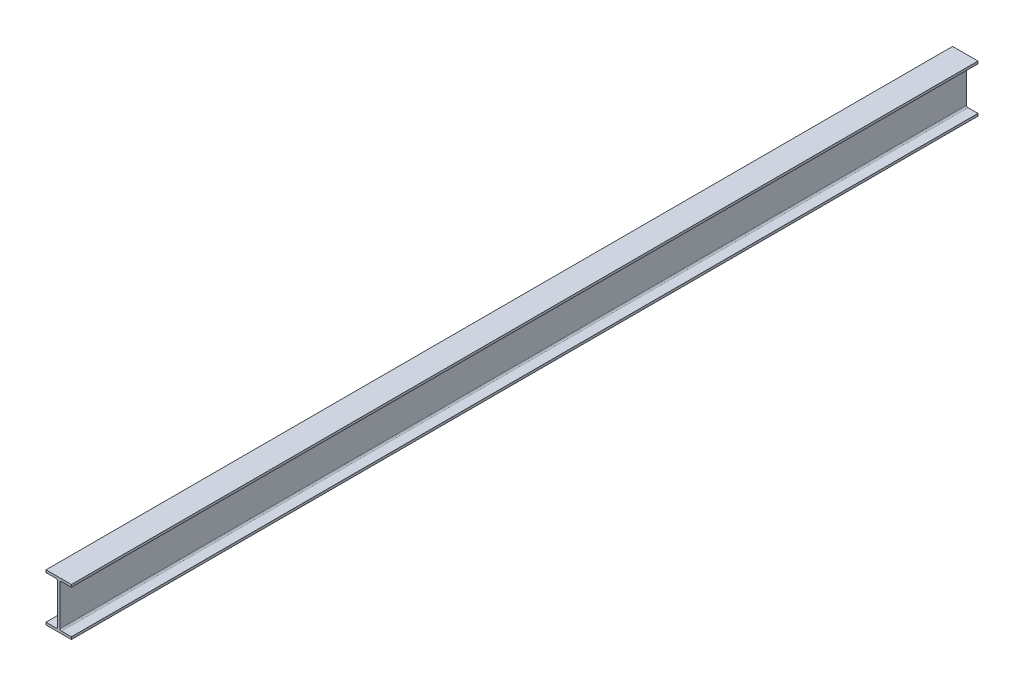
ISO-10303-21;
HEADER;
FILE_DESCRIPTION(('STEP AP214'),'2;1');
FILE_NAME('part.step','',(''),(''),'','','');
FILE_SCHEMA(('AUTOMOTIVE_DESIGN { 1 0 10303 214 1 1 1 1 }'));
ENDSEC;
DATA;
#1=APPLICATION_CONTEXT('core data for automotive mechanical design processes');
#2=APPLICATION_PROTOCOL_DEFINITION('international standard','automotive_design',2000,#1);
#3=PRODUCT_CONTEXT('',#1,'mechanical');
#4=PRODUCT('Part','Part','',(#3));
#5=PRODUCT_RELATED_PRODUCT_CATEGORY('part','',(#4));
#6=PRODUCT_DEFINITION_FORMATION('','',#4);
#7=PRODUCT_DEFINITION_CONTEXT('part definition',#1,'design');
#8=PRODUCT_DEFINITION('design','',#6,#7);
#9=PRODUCT_DEFINITION_SHAPE('','',#8);
#10=(LENGTH_UNIT() NAMED_UNIT(*) SI_UNIT(.MILLI.,.METRE.));
#11=(NAMED_UNIT(*) PLANE_ANGLE_UNIT() SI_UNIT($,.RADIAN.));
#12=(NAMED_UNIT(*) SI_UNIT($,.STERADIAN.) SOLID_ANGLE_UNIT());
#13=UNCERTAINTY_MEASURE_WITH_UNIT(LENGTH_MEASURE(1.E-05),#10,'distance_accuracy_value','');
#14=(GEOMETRIC_REPRESENTATION_CONTEXT(3) GLOBAL_UNCERTAINTY_ASSIGNED_CONTEXT((#13)) GLOBAL_UNIT_ASSIGNED_CONTEXT((#10,
#11,#12)) REPRESENTATION_CONTEXT('',''));
#15=CARTESIAN_POINT('',(0.,0.,0.));
#16=DIRECTION('',(0.,0.,1.));
#17=DIRECTION('',(1.,0.,0.));
#18=AXIS2_PLACEMENT_3D('',#15,#16,#17);
#19=CARTESIAN_POINT('',(-8.99999999999999,-66.,3000.));
#20=DIRECTION('',(0.,0.,-1.));
#21=DIRECTION('',(-1.,0.,0.));
#22=AXIS2_PLACEMENT_3D('',#19,#20,#21);
#23=CYLINDRICAL_SURFACE('',#22,5.);
#24=CARTESIAN_POINT('',(-8.99999999999999,-66.,0.));
#25=DIRECTION('',(0.,0.,-1.));
#26=DIRECTION('',(1.,0.,0.));
#27=AXIS2_PLACEMENT_3D('',#24,#25,#26);
#28=CIRCLE('',#27,5.);
#29=CARTESIAN_POINT('',(-4.,-66.,0.));
#30=VERTEX_POINT('',#29);
#31=CARTESIAN_POINT('',(-9.00000000000003,-71.,0.));
#32=VERTEX_POINT('',#31);
#33=EDGE_CURVE('E194',#30,#32,#28,.T.);
#34=ORIENTED_EDGE('',*,*,#33,.T.);
#35=DIRECTION('',(0.,0.,-1.));
#36=VECTOR('',#35,1.);
#37=CARTESIAN_POINT('',(-9.00000000000003,-71.,3000.));
#38=LINE('',#37,#36);
#39=CARTESIAN_POINT('',(-9.00000000000003,-71.,3000.));
#40=VERTEX_POINT('',#39);
#41=EDGE_CURVE('E11',#40,#32,#38,.T.);
#42=ORIENTED_EDGE('',*,*,#41,.F.);
#43=CARTESIAN_POINT('',(-8.99999999999999,-66.,3000.));
#44=DIRECTION('',(0.,0.,-1.));
#45=DIRECTION('',(1.,0.,0.));
#46=AXIS2_PLACEMENT_3D('',#43,#44,#45);
#47=CIRCLE('',#46,5.);
#48=CARTESIAN_POINT('',(-4.,-66.,3000.));
#49=VERTEX_POINT('',#48);
#50=EDGE_CURVE('E240',#49,#40,#47,.T.);
#51=ORIENTED_EDGE('',*,*,#50,.F.);
#52=DIRECTION('',(0.,0.,-1.));
#53=VECTOR('',#52,1.);
#54=CARTESIAN_POINT('',(-4.,-66.,3000.));
#55=LINE('',#54,#53);
#56=EDGE_CURVE('E190',#49,#30,#55,.T.);
#57=ORIENTED_EDGE('',*,*,#56,.T.);
#58=EDGE_LOOP('',(#34,#42,#51,#57));
#59=FACE_BOUND('',#58,.T.);
#60=ADVANCED_FACE('F45',(#59),#23,.F.);
#61=CARTESIAN_POINT('',(-9.00000000000003,-71.,3000.));
#62=DIRECTION('',(0.,-1.,0.));
#63=DIRECTION('',(1.,0.,0.));
#64=AXIS2_PLACEMENT_3D('',#61,#62,#63);
#65=PLANE('',#64);
#66=DIRECTION('',(-1.,0.,0.));
#67=VECTOR('',#66,1.);
#68=CARTESIAN_POINT('',(-9.00000000000003,-71.,0.));
#69=LINE('',#68,#67);
#70=CARTESIAN_POINT('',(-42.,-71.,0.));
#71=VERTEX_POINT('',#70);
#72=EDGE_CURVE('E198',#32,#71,#69,.T.);
#73=ORIENTED_EDGE('',*,*,#72,.T.);
#74=DIRECTION('',(0.,0.,-1.));
#75=VECTOR('',#74,1.);
#76=CARTESIAN_POINT('',(-42.,-71.,3000.));
#77=LINE('',#76,#75);
#78=CARTESIAN_POINT('',(-42.,-71.,3000.));
#79=VERTEX_POINT('',#78);
#80=EDGE_CURVE('E54',#79,#71,#77,.T.);
#81=ORIENTED_EDGE('',*,*,#80,.F.);
#82=DIRECTION('',(-1.,0.,0.));
#83=VECTOR('',#82,1.);
#84=CARTESIAN_POINT('',(-9.00000000000003,-71.,3000.));
#85=LINE('',#84,#83);
#86=EDGE_CURVE('E129',#40,#79,#85,.T.);
#87=ORIENTED_EDGE('',*,*,#86,.F.);
#88=ORIENTED_EDGE('',*,*,#41,.T.);
#89=EDGE_LOOP('',(#73,#81,#87,#88));
#90=FACE_BOUND('',#89,.T.);
#91=ADVANCED_FACE('F362',(#90),#65,.F.);
#92=CARTESIAN_POINT('',(-42.,-71.,3000.));
#93=DIRECTION('',(1.,0.,0.));
#94=DIRECTION('',(0.,0.,-1.));
#95=AXIS2_PLACEMENT_3D('',#92,#93,#94);
#96=PLANE('',#95);
#97=DIRECTION('',(0.,-1.,0.));
#98=VECTOR('',#97,1.);
#99=CARTESIAN_POINT('',(-42.,-71.,0.));
#100=LINE('',#99,#98);
#101=CARTESIAN_POINT('',(-42.,-79.,0.));
#102=VERTEX_POINT('',#101);
#103=EDGE_CURVE('E201',#71,#102,#100,.T.);
#104=ORIENTED_EDGE('',*,*,#103,.T.);
#105=DIRECTION('',(0.,0.,-1.));
#106=VECTOR('',#105,1.);
#107=CARTESIAN_POINT('',(-42.,-79.,3000.));
#108=LINE('',#107,#106);
#109=CARTESIAN_POINT('',(-42.,-79.,3000.));
#110=VERTEX_POINT('',#109);
#111=EDGE_CURVE('E283',#110,#102,#108,.T.);
#112=ORIENTED_EDGE('',*,*,#111,.F.);
#113=DIRECTION('',(0.,-1.,0.));
#114=VECTOR('',#113,1.);
#115=CARTESIAN_POINT('',(-42.,-71.,3000.));
#116=LINE('',#115,#114);
#117=EDGE_CURVE('E293',#79,#110,#116,.T.);
#118=ORIENTED_EDGE('',*,*,#117,.F.);
#119=ORIENTED_EDGE('',*,*,#80,.T.);
#120=EDGE_LOOP('',(#104,#112,#118,#119));
#121=FACE_BOUND('',#120,.T.);
#122=ADVANCED_FACE('F291',(#121),#96,.F.);
#123=CARTESIAN_POINT('',(-42.,-79.,3000.));
#124=DIRECTION('',(0.,1.,0.));
#125=DIRECTION('',(0.,0.,1.));
#126=AXIS2_PLACEMENT_3D('',#123,#124,#125);
#127=PLANE('',#126);
#128=DIRECTION('',(1.,0.,0.));
#129=VECTOR('',#128,1.);
#130=CARTESIAN_POINT('',(-42.,-79.,0.));
#131=LINE('',#130,#129);
#132=CARTESIAN_POINT('',(42.,-79.,0.));
#133=VERTEX_POINT('',#132);
#134=EDGE_CURVE('E204',#102,#133,#131,.T.);
#135=ORIENTED_EDGE('',*,*,#134,.T.);
#136=DIRECTION('',(0.,0.,-1.));
#137=VECTOR('',#136,1.);
#138=CARTESIAN_POINT('',(42.,-79.,3000.));
#139=LINE('',#138,#137);
#140=CARTESIAN_POINT('',(42.,-79.,3000.));
#141=VERTEX_POINT('',#140);
#142=EDGE_CURVE('E279',#141,#133,#139,.T.);
#143=ORIENTED_EDGE('',*,*,#142,.F.);
#144=DIRECTION('',(1.,0.,0.));
#145=VECTOR('',#144,1.);
#146=CARTESIAN_POINT('',(-42.,-79.,3000.));
#147=LINE('',#146,#145);
#148=EDGE_CURVE('E312',#110,#141,#147,.T.);
#149=ORIENTED_EDGE('',*,*,#148,.F.);
#150=ORIENTED_EDGE('',*,*,#111,.T.);
#151=EDGE_LOOP('',(#135,#143,#149,#150));
#152=FACE_BOUND('',#151,.T.);
#153=ADVANCED_FACE('F302',(#152),#127,.F.);
#154=CARTESIAN_POINT('',(42.,-79.,3000.));
#155=DIRECTION('',(-1.,0.,0.));
#156=DIRECTION('',(0.,0.,1.));
#157=AXIS2_PLACEMENT_3D('',#154,#155,#156);
#158=PLANE('',#157);
#159=DIRECTION('',(0.,1.,0.));
#160=VECTOR('',#159,1.);
#161=CARTESIAN_POINT('',(42.,-79.,0.));
#162=LINE('',#161,#160);
#163=CARTESIAN_POINT('',(42.,-71.,0.));
#164=VERTEX_POINT('',#163);
#165=EDGE_CURVE('E207',#133,#164,#162,.T.);
#166=ORIENTED_EDGE('',*,*,#165,.T.);
#167=DIRECTION('',(0.,0.,-1.));
#168=VECTOR('',#167,1.);
#169=CARTESIAN_POINT('',(42.,-71.,3000.));
#170=LINE('',#169,#168);
#171=CARTESIAN_POINT('',(42.,-71.,3000.));
#172=VERTEX_POINT('',#171);
#173=EDGE_CURVE('E275',#172,#164,#170,.T.);
#174=ORIENTED_EDGE('',*,*,#173,.F.);
#175=DIRECTION('',(0.,1.,0.));
#176=VECTOR('',#175,1.);
#177=CARTESIAN_POINT('',(42.,-79.,3000.));
#178=LINE('',#177,#176);
#179=EDGE_CURVE('E308',#141,#172,#178,.T.);
#180=ORIENTED_EDGE('',*,*,#179,.F.);
#181=ORIENTED_EDGE('',*,*,#142,.T.);
#182=EDGE_LOOP('',(#166,#174,#180,#181));
#183=FACE_BOUND('',#182,.T.);
#184=ADVANCED_FACE('F306',(#183),#158,.F.);
#185=CARTESIAN_POINT('',(42.,-71.,3000.));
#186=DIRECTION('',(0.,-1.,0.));
#187=DIRECTION('',(0.,0.,-1.));
#188=AXIS2_PLACEMENT_3D('',#185,#186,#187);
#189=PLANE('',#188);
#190=DIRECTION('',(-1.,0.,0.));
#191=VECTOR('',#190,1.);
#192=CARTESIAN_POINT('',(42.,-71.,0.));
#193=LINE('',#192,#191);
#194=CARTESIAN_POINT('',(9.00000000000003,-71.,0.));
#195=VERTEX_POINT('',#194);
#196=EDGE_CURVE('E210',#164,#195,#193,.T.);
#197=ORIENTED_EDGE('',*,*,#196,.T.);
#198=DIRECTION('',(0.,0.,-1.));
#199=VECTOR('',#198,1.);
#200=CARTESIAN_POINT('',(9.00000000000003,-71.,3000.));
#201=LINE('',#200,#199);
#202=CARTESIAN_POINT('',(9.00000000000003,-71.,3000.));
#203=VERTEX_POINT('',#202);
#204=EDGE_CURVE('E271',#203,#195,#201,.T.);
#205=ORIENTED_EDGE('',*,*,#204,.F.);
#206=DIRECTION('',(-1.,0.,0.));
#207=VECTOR('',#206,1.);
#208=CARTESIAN_POINT('',(42.,-71.,3000.));
#209=LINE('',#208,#207);
#210=EDGE_CURVE('E311',#172,#203,#209,.T.);
#211=ORIENTED_EDGE('',*,*,#210,.F.);
#212=ORIENTED_EDGE('',*,*,#173,.T.);
#213=EDGE_LOOP('',(#197,#205,#211,#212));
#214=FACE_BOUND('',#213,.T.);
#215=ADVANCED_FACE('F375',(#214),#189,.F.);
#216=CARTESIAN_POINT('',(9.,-66.,3000.));
#217=DIRECTION('',(0.,0.,-1.));
#218=DIRECTION('',(-1.,0.,0.));
#219=AXIS2_PLACEMENT_3D('',#216,#217,#218);
#220=CYLINDRICAL_SURFACE('',#219,5.);
#221=CARTESIAN_POINT('',(9.,-66.,0.));
#222=DIRECTION('',(0.,0.,-1.));
#223=DIRECTION('',(-1.,0.,0.));
#224=AXIS2_PLACEMENT_3D('',#221,#222,#223);
#225=CIRCLE('',#224,5.);
#226=CARTESIAN_POINT('',(4.,-66.,0.));
#227=VERTEX_POINT('',#226);
#228=EDGE_CURVE('E213',#195,#227,#225,.T.);
#229=ORIENTED_EDGE('',*,*,#228,.T.);
#230=DIRECTION('',(0.,0.,-1.));
#231=VECTOR('',#230,1.);
#232=CARTESIAN_POINT('',(4.,-66.,3000.));
#233=LINE('',#232,#231);
#234=CARTESIAN_POINT('',(4.,-66.,3000.));
#235=VERTEX_POINT('',#234);
#236=EDGE_CURVE('E267',#235,#227,#233,.T.);
#237=ORIENTED_EDGE('',*,*,#236,.F.);
#238=CARTESIAN_POINT('',(9.,-66.,3000.));
#239=DIRECTION('',(0.,0.,-1.));
#240=DIRECTION('',(-1.,0.,0.));
#241=AXIS2_PLACEMENT_3D('',#238,#239,#240);
#242=CIRCLE('',#241,5.);
#243=EDGE_CURVE('E316',#203,#235,#242,.T.);
#244=ORIENTED_EDGE('',*,*,#243,.F.);
#245=ORIENTED_EDGE('',*,*,#204,.T.);
#246=EDGE_LOOP('',(#229,#237,#244,#245));
#247=FACE_BOUND('',#246,.T.);
#248=ADVANCED_FACE('F378',(#247),#220,.F.);
#249=CARTESIAN_POINT('',(3.99999999999999,66.,3000.));
#250=DIRECTION('',(-1.,0.,0.));
#251=DIRECTION('',(0.,-1.,0.));
#252=AXIS2_PLACEMENT_3D('',#249,#250,#251);
#253=PLANE('',#252);
#254=DIRECTION('',(0.,1.,0.));
#255=VECTOR('',#254,1.);
#256=CARTESIAN_POINT('',(3.99999999999999,66.,0.));
#257=LINE('',#256,#255);
#258=CARTESIAN_POINT('',(3.99999999999999,66.,0.));
#259=VERTEX_POINT('',#258);
#260=EDGE_CURVE('E216',#227,#259,#257,.T.);
#261=ORIENTED_EDGE('',*,*,#260,.T.);
#262=DIRECTION('',(0.,0.,-1.));
#263=VECTOR('',#262,1.);
#264=CARTESIAN_POINT('',(3.99999999999999,66.,3000.));
#265=LINE('',#264,#263);
#266=CARTESIAN_POINT('',(3.99999999999999,66.,3000.));
#267=VERTEX_POINT('',#266);
#268=EDGE_CURVE('E263',#267,#259,#265,.T.);
#269=ORIENTED_EDGE('',*,*,#268,.F.);
#270=DIRECTION('',(0.,1.,0.));
#271=VECTOR('',#270,1.);
#272=CARTESIAN_POINT('',(3.99999999999999,66.,3000.));
#273=LINE('',#272,#271);
#274=EDGE_CURVE('E323',#235,#267,#273,.T.);
#275=ORIENTED_EDGE('',*,*,#274,.F.);
#276=ORIENTED_EDGE('',*,*,#236,.T.);
#277=EDGE_LOOP('',(#261,#269,#275,#276));
#278=FACE_BOUND('',#277,.T.);
#279=ADVANCED_FACE('F382',(#278),#253,.F.);
#280=CARTESIAN_POINT('',(8.99999999999999,66.,3000.));
#281=DIRECTION('',(0.,0.,-1.));
#282=DIRECTION('',(-1.,0.,0.));
#283=AXIS2_PLACEMENT_3D('',#280,#281,#282);
#284=CYLINDRICAL_SURFACE('',#283,5.);
#285=CARTESIAN_POINT('',(8.99999999999999,66.,0.));
#286=DIRECTION('',(0.,0.,-1.));
#287=DIRECTION('',(1.,0.,0.));
#288=AXIS2_PLACEMENT_3D('',#285,#286,#287);
#289=CIRCLE('',#288,5.);
#290=CARTESIAN_POINT('',(9.00000000000003,71.,0.));
#291=VERTEX_POINT('',#290);
#292=EDGE_CURVE('E219',#259,#291,#289,.T.);
#293=ORIENTED_EDGE('',*,*,#292,.T.);
#294=DIRECTION('',(0.,0.,-1.));
#295=VECTOR('',#294,1.);
#296=CARTESIAN_POINT('',(9.00000000000003,71.,3000.));
#297=LINE('',#296,#295);
#298=CARTESIAN_POINT('',(9.00000000000003,71.,3000.));
#299=VERTEX_POINT('',#298);
#300=EDGE_CURVE('E259',#299,#291,#297,.T.);
#301=ORIENTED_EDGE('',*,*,#300,.F.);
#302=CARTESIAN_POINT('',(8.99999999999999,66.,3000.));
#303=DIRECTION('',(0.,0.,-1.));
#304=DIRECTION('',(1.,0.,0.));
#305=AXIS2_PLACEMENT_3D('',#302,#303,#304);
#306=CIRCLE('',#305,5.);
#307=EDGE_CURVE('E326',#267,#299,#306,.T.);
#308=ORIENTED_EDGE('',*,*,#307,.F.);
#309=ORIENTED_EDGE('',*,*,#268,.T.);
#310=EDGE_LOOP('',(#293,#301,#308,#309));
#311=FACE_BOUND('',#310,.T.);
#312=ADVANCED_FACE('F386',(#311),#284,.F.);
#313=CARTESIAN_POINT('',(42.,71.,3000.));
#314=DIRECTION('',(0.,1.,0.));
#315=DIRECTION('',(0.,0.,1.));
#316=AXIS2_PLACEMENT_3D('',#313,#314,#315);
#317=PLANE('',#316);
#318=DIRECTION('',(1.,0.,0.));
#319=VECTOR('',#318,1.);
#320=CARTESIAN_POINT('',(42.,71.,0.));
#321=LINE('',#320,#319);
#322=CARTESIAN_POINT('',(42.,71.,0.));
#323=VERTEX_POINT('',#322);
#324=EDGE_CURVE('E222',#291,#323,#321,.T.);
#325=ORIENTED_EDGE('',*,*,#324,.T.);
#326=DIRECTION('',(0.,0.,-1.));
#327=VECTOR('',#326,1.);
#328=CARTESIAN_POINT('',(42.,71.,3000.));
#329=LINE('',#328,#327);
#330=CARTESIAN_POINT('',(42.,71.,3000.));
#331=VERTEX_POINT('',#330);
#332=EDGE_CURVE('E255',#331,#323,#329,.T.);
#333=ORIENTED_EDGE('',*,*,#332,.F.);
#334=DIRECTION('',(1.,0.,0.));
#335=VECTOR('',#334,1.);
#336=CARTESIAN_POINT('',(42.,71.,3000.));
#337=LINE('',#336,#335);
#338=EDGE_CURVE('E329',#299,#331,#337,.T.);
#339=ORIENTED_EDGE('',*,*,#338,.F.);
#340=ORIENTED_EDGE('',*,*,#300,.T.);
#341=EDGE_LOOP('',(#325,#333,#339,#340));
#342=FACE_BOUND('',#341,.T.);
#343=ADVANCED_FACE('F390',(#342),#317,.F.);
#344=CARTESIAN_POINT('',(42.,79.,3000.));
#345=DIRECTION('',(-1.,0.,0.));
#346=DIRECTION('',(0.,0.,1.));
#347=AXIS2_PLACEMENT_3D('',#344,#345,#346);
#348=PLANE('',#347);
#349=DIRECTION('',(0.,1.,0.));
#350=VECTOR('',#349,1.);
#351=CARTESIAN_POINT('',(42.,79.,0.));
#352=LINE('',#351,#350);
#353=CARTESIAN_POINT('',(42.,79.,0.));
#354=VERTEX_POINT('',#353);
#355=EDGE_CURVE('E225',#323,#354,#352,.T.);
#356=ORIENTED_EDGE('',*,*,#355,.T.);
#357=DIRECTION('',(0.,0.,-1.));
#358=VECTOR('',#357,1.);
#359=CARTESIAN_POINT('',(42.,79.,3000.));
#360=LINE('',#359,#358);
#361=CARTESIAN_POINT('',(42.,79.,3000.));
#362=VERTEX_POINT('',#361);
#363=EDGE_CURVE('E251',#362,#354,#360,.T.);
#364=ORIENTED_EDGE('',*,*,#363,.F.);
#365=DIRECTION('',(0.,1.,0.));
#366=VECTOR('',#365,1.);
#367=CARTESIAN_POINT('',(42.,79.,3000.));
#368=LINE('',#367,#366);
#369=EDGE_CURVE('E332',#331,#362,#368,.T.);
#370=ORIENTED_EDGE('',*,*,#369,.F.);
#371=ORIENTED_EDGE('',*,*,#332,.T.);
#372=EDGE_LOOP('',(#356,#364,#370,#371));
#373=FACE_BOUND('',#372,.T.);
#374=ADVANCED_FACE('F394',(#373),#348,.F.);
#375=CARTESIAN_POINT('',(-42.,79.,3000.));
#376=DIRECTION('',(0.,-1.,0.));
#377=DIRECTION('',(0.,0.,-1.));
#378=AXIS2_PLACEMENT_3D('',#375,#376,#377);
#379=PLANE('',#378);
#380=DIRECTION('',(-1.,0.,0.));
#381=VECTOR('',#380,1.);
#382=CARTESIAN_POINT('',(-42.,79.,0.));
#383=LINE('',#382,#381);
#384=CARTESIAN_POINT('',(-42.,79.,0.));
#385=VERTEX_POINT('',#384);
#386=EDGE_CURVE('E228',#354,#385,#383,.T.);
#387=ORIENTED_EDGE('',*,*,#386,.T.);
#388=DIRECTION('',(0.,0.,-1.));
#389=VECTOR('',#388,1.);
#390=CARTESIAN_POINT('',(-42.,79.,3000.));
#391=LINE('',#390,#389);
#392=CARTESIAN_POINT('',(-42.,79.,3000.));
#393=VERTEX_POINT('',#392);
#394=EDGE_CURVE('E247',#393,#385,#391,.T.);
#395=ORIENTED_EDGE('',*,*,#394,.F.);
#396=DIRECTION('',(-1.,0.,0.));
#397=VECTOR('',#396,1.);
#398=CARTESIAN_POINT('',(-42.,79.,3000.));
#399=LINE('',#398,#397);
#400=EDGE_CURVE('E335',#362,#393,#399,.T.);
#401=ORIENTED_EDGE('',*,*,#400,.F.);
#402=ORIENTED_EDGE('',*,*,#363,.T.);
#403=EDGE_LOOP('',(#387,#395,#401,#402));
#404=FACE_BOUND('',#403,.T.);
#405=ADVANCED_FACE('F343',(#404),#379,.F.);
#406=CARTESIAN_POINT('',(-42.,71.,3000.));
#407=DIRECTION('',(1.,0.,0.));
#408=DIRECTION('',(0.,0.,-1.));
#409=AXIS2_PLACEMENT_3D('',#406,#407,#408);
#410=PLANE('',#409);
#411=DIRECTION('',(0.,-1.,0.));
#412=VECTOR('',#411,1.);
#413=CARTESIAN_POINT('',(-42.,71.,0.));
#414=LINE('',#413,#412);
#415=CARTESIAN_POINT('',(-42.,71.,0.));
#416=VERTEX_POINT('',#415);
#417=EDGE_CURVE('E231',#385,#416,#414,.T.);
#418=ORIENTED_EDGE('',*,*,#417,.T.);
#419=DIRECTION('',(0.,0.,-1.));
#420=VECTOR('',#419,1.);
#421=CARTESIAN_POINT('',(-42.,71.,3000.));
#422=LINE('',#421,#420);
#423=CARTESIAN_POINT('',(-42.,71.,3000.));
#424=VERTEX_POINT('',#423);
#425=EDGE_CURVE('E183',#424,#416,#422,.T.);
#426=ORIENTED_EDGE('',*,*,#425,.F.);
#427=DIRECTION('',(0.,-1.,0.));
#428=VECTOR('',#427,1.);
#429=CARTESIAN_POINT('',(-42.,71.,3000.));
#430=LINE('',#429,#428);
#431=EDGE_CURVE('E172',#393,#424,#430,.T.);
#432=ORIENTED_EDGE('',*,*,#431,.F.);
#433=ORIENTED_EDGE('',*,*,#394,.T.);
#434=EDGE_LOOP('',(#418,#426,#432,#433));
#435=FACE_BOUND('',#434,.T.);
#436=ADVANCED_FACE('F347',(#435),#410,.F.);
#437=CARTESIAN_POINT('',(-9.00000000000004,71.,3000.));
#438=DIRECTION('',(0.,1.,0.));
#439=DIRECTION('',(-1.,0.,0.));
#440=AXIS2_PLACEMENT_3D('',#437,#438,#439);
#441=PLANE('',#440);
#442=DIRECTION('',(1.,0.,0.));
#443=VECTOR('',#442,1.);
#444=CARTESIAN_POINT('',(-9.00000000000004,71.,0.));
#445=LINE('',#444,#443);
#446=CARTESIAN_POINT('',(-9.00000000000004,71.,0.));
#447=VERTEX_POINT('',#446);
#448=EDGE_CURVE('E181',#416,#447,#445,.T.);
#449=ORIENTED_EDGE('',*,*,#448,.T.);
#450=DIRECTION('',(0.,0.,-1.));
#451=VECTOR('',#450,1.);
#452=CARTESIAN_POINT('',(-9.00000000000004,71.,3000.));
#453=LINE('',#452,#451);
#454=CARTESIAN_POINT('',(-9.00000000000004,71.,3000.));
#455=VERTEX_POINT('',#454);
#456=EDGE_CURVE('E178',#455,#447,#453,.T.);
#457=ORIENTED_EDGE('',*,*,#456,.F.);
#458=DIRECTION('',(1.,0.,0.));
#459=VECTOR('',#458,1.);
#460=CARTESIAN_POINT('',(-9.00000000000004,71.,3000.));
#461=LINE('',#460,#459);
#462=EDGE_CURVE('E166',#424,#455,#461,.T.);
#463=ORIENTED_EDGE('',*,*,#462,.F.);
#464=ORIENTED_EDGE('',*,*,#425,.T.);
#465=EDGE_LOOP('',(#449,#457,#463,#464));
#466=FACE_BOUND('',#465,.T.);
#467=ADVANCED_FACE('F179',(#466),#441,.F.);
#468=CARTESIAN_POINT('',(-9.,66.,3000.));
#469=DIRECTION('',(0.,0.,-1.));
#470=DIRECTION('',(-1.,0.,0.));
#471=AXIS2_PLACEMENT_3D('',#468,#469,#470);
#472=CYLINDRICAL_SURFACE('',#471,5.);
#473=CARTESIAN_POINT('',(-9.,66.,0.));
#474=DIRECTION('',(0.,0.,-1.));
#475=DIRECTION('',(1.,0.,0.));
#476=AXIS2_PLACEMENT_3D('',#473,#474,#475);
#477=CIRCLE('',#476,5.);
#478=CARTESIAN_POINT('',(-4.,66.,0.));
#479=VERTEX_POINT('',#478);
#480=EDGE_CURVE('E115',#447,#479,#477,.T.);
#481=ORIENTED_EDGE('',*,*,#480,.T.);
#482=DIRECTION('',(0.,0.,-1.));
#483=VECTOR('',#482,1.);
#484=CARTESIAN_POINT('',(-4.,66.,3000.));
#485=LINE('',#484,#483);
#486=CARTESIAN_POINT('',(-4.,66.,3000.));
#487=VERTEX_POINT('',#486);
#488=EDGE_CURVE('E184',#487,#479,#485,.T.);
#489=ORIENTED_EDGE('',*,*,#488,.F.);
#490=CARTESIAN_POINT('',(-9.,66.,3000.));
#491=DIRECTION('',(0.,0.,-1.));
#492=DIRECTION('',(1.,0.,0.));
#493=AXIS2_PLACEMENT_3D('',#490,#491,#492);
#494=CIRCLE('',#493,5.);
#495=EDGE_CURVE('E170',#455,#487,#494,.T.);
#496=ORIENTED_EDGE('',*,*,#495,.F.);
#497=ORIENTED_EDGE('',*,*,#456,.T.);
#498=EDGE_LOOP('',(#481,#489,#496,#497));
#499=FACE_BOUND('',#498,.T.);
#500=ADVANCED_FACE('F186',(#499),#472,.F.);
#501=CARTESIAN_POINT('',(-4.,-66.,3000.));
#502=DIRECTION('',(1.,0.,0.));
#503=DIRECTION('',(0.,1.,0.));
#504=AXIS2_PLACEMENT_3D('',#501,#502,#503);
#505=PLANE('',#504);
#506=DIRECTION('',(0.,-1.,0.));
#507=VECTOR('',#506,1.);
#508=CARTESIAN_POINT('',(-4.,-66.,0.));
#509=LINE('',#508,#507);
#510=EDGE_CURVE('E121',#479,#30,#509,.T.);
#511=ORIENTED_EDGE('',*,*,#510,.T.);
#512=ORIENTED_EDGE('',*,*,#56,.F.);
#513=DIRECTION('',(0.,-1.,0.));
#514=VECTOR('',#513,1.);
#515=CARTESIAN_POINT('',(-4.,-66.,3000.));
#516=LINE('',#515,#514);
#517=EDGE_CURVE('E62',#487,#49,#516,.T.);
#518=ORIENTED_EDGE('',*,*,#517,.F.);
#519=ORIENTED_EDGE('',*,*,#488,.T.);
#520=EDGE_LOOP('',(#511,#512,#518,#519));
#521=FACE_BOUND('',#520,.T.);
#522=ADVANCED_FACE('F351',(#521),#505,.F.);
#523=CARTESIAN_POINT('',(-8.99999999999999,-66.,3000.));
#524=DIRECTION('',(0.,0.,1.));
#525=DIRECTION('',(1.,0.,0.));
#526=AXIS2_PLACEMENT_3D('',#523,#524,#525);
#527=PLANE('',#526);
#528=ORIENTED_EDGE('',*,*,#50,.T.);
#529=ORIENTED_EDGE('',*,*,#86,.T.);
#530=ORIENTED_EDGE('',*,*,#117,.T.);
#531=ORIENTED_EDGE('',*,*,#148,.T.);
#532=ORIENTED_EDGE('',*,*,#179,.T.);
#533=ORIENTED_EDGE('',*,*,#210,.T.);
#534=ORIENTED_EDGE('',*,*,#243,.T.);
#535=ORIENTED_EDGE('',*,*,#274,.T.);
#536=ORIENTED_EDGE('',*,*,#307,.T.);
#537=ORIENTED_EDGE('',*,*,#338,.T.);
#538=ORIENTED_EDGE('',*,*,#369,.T.);
#539=ORIENTED_EDGE('',*,*,#400,.T.);
#540=ORIENTED_EDGE('',*,*,#431,.T.);
#541=ORIENTED_EDGE('',*,*,#462,.T.);
#542=ORIENTED_EDGE('',*,*,#495,.T.);
#543=ORIENTED_EDGE('',*,*,#517,.T.);
#544=EDGE_LOOP('',(#528,#529,#530,#531,#532,#533,#534,#535,#536,#537,#538,#539,#540,#541,#542,#543));
#545=FACE_BOUND('',#544,.T.);
#546=ADVANCED_FACE('F168',(#545),#527,.T.);
#547=CARTESIAN_POINT('',(-8.99999999999999,-66.,0.));
#548=DIRECTION('',(0.,0.,1.));
#549=DIRECTION('',(1.,0.,0.));
#550=AXIS2_PLACEMENT_3D('',#547,#548,#549);
#551=PLANE('',#550);
#552=ORIENTED_EDGE('',*,*,#33,.F.);
#553=ORIENTED_EDGE('',*,*,#510,.F.);
#554=ORIENTED_EDGE('',*,*,#480,.F.);
#555=ORIENTED_EDGE('',*,*,#448,.F.);
#556=ORIENTED_EDGE('',*,*,#417,.F.);
#557=ORIENTED_EDGE('',*,*,#386,.F.);
#558=ORIENTED_EDGE('',*,*,#355,.F.);
#559=ORIENTED_EDGE('',*,*,#324,.F.);
#560=ORIENTED_EDGE('',*,*,#292,.F.);
#561=ORIENTED_EDGE('',*,*,#260,.F.);
#562=ORIENTED_EDGE('',*,*,#228,.F.);
#563=ORIENTED_EDGE('',*,*,#196,.F.);
#564=ORIENTED_EDGE('',*,*,#165,.F.);
#565=ORIENTED_EDGE('',*,*,#134,.F.);
#566=ORIENTED_EDGE('',*,*,#103,.F.);
#567=ORIENTED_EDGE('',*,*,#72,.F.);
#568=EDGE_LOOP('',(#552,#553,#554,#555,#556,#557,#558,#559,#560,#561,#562,#563,#564,#565,#566,#567));
#569=FACE_BOUND('',#568,.T.);
#570=ADVANCED_FACE('F297',(#569),#551,.F.);
#571=CLOSED_SHELL('',(#60,#91,#122,#153,#184,#215,#248,#279,#312,#343,#374,#405,#436,#467,#500,
#522,#546,#570));
#572=MANIFOLD_SOLID_BREP('B2',#571);
#573=ADVANCED_BREP_SHAPE_REPRESENTATION('',(#18,#572),#14);
#574=SHAPE_DEFINITION_REPRESENTATION(#9,#573);
ENDSEC;
END-ISO-10303-21;
